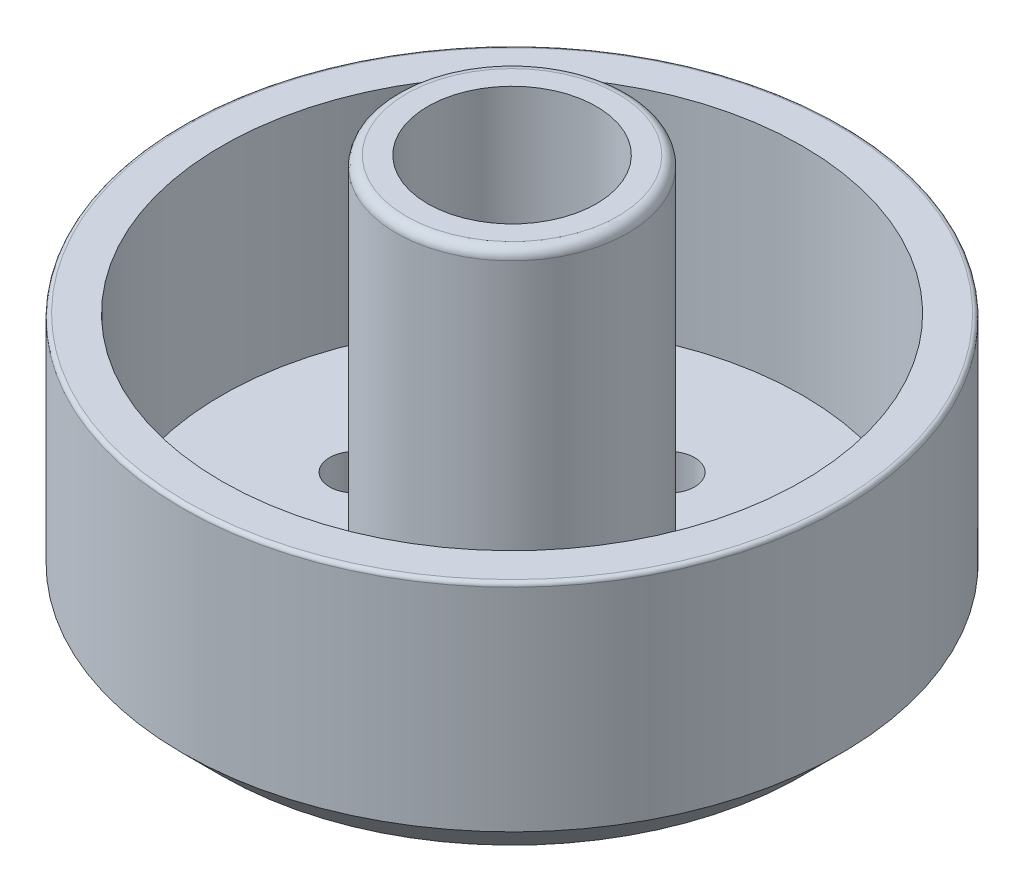
ISO-10303-21;
HEADER;
FILE_DESCRIPTION(('STEP AP214'),'2;1');
FILE_NAME('part.step','',(''),(''),'','','');
FILE_SCHEMA(('AUTOMOTIVE_DESIGN { 1 0 10303 214 1 1 1 1 }'));
ENDSEC;
DATA;
#1=APPLICATION_CONTEXT('core data for automotive mechanical design processes');
#2=APPLICATION_PROTOCOL_DEFINITION('international standard','automotive_design',2000,#1);
#3=PRODUCT_CONTEXT('',#1,'mechanical');
#4=PRODUCT('Part','Part','',(#3));
#5=PRODUCT_RELATED_PRODUCT_CATEGORY('part','',(#4));
#6=PRODUCT_DEFINITION_FORMATION('','',#4);
#7=PRODUCT_DEFINITION_CONTEXT('part definition',#1,'design');
#8=PRODUCT_DEFINITION('design','',#6,#7);
#9=PRODUCT_DEFINITION_SHAPE('','',#8);
#10=(LENGTH_UNIT() NAMED_UNIT(*) SI_UNIT(.MILLI.,.METRE.));
#11=(NAMED_UNIT(*) PLANE_ANGLE_UNIT() SI_UNIT($,.RADIAN.));
#12=(NAMED_UNIT(*) SI_UNIT($,.STERADIAN.) SOLID_ANGLE_UNIT());
#13=UNCERTAINTY_MEASURE_WITH_UNIT(LENGTH_MEASURE(1.E-05),#10,'distance_accuracy_value','');
#14=(GEOMETRIC_REPRESENTATION_CONTEXT(3) GLOBAL_UNCERTAINTY_ASSIGNED_CONTEXT((#13)) GLOBAL_UNIT_ASSIGNED_CONTEXT((#10,
#11,#12)) REPRESENTATION_CONTEXT('',''));
#15=CARTESIAN_POINT('',(0.,0.,0.));
#16=DIRECTION('',(0.,0.,1.));
#17=DIRECTION('',(1.,0.,0.));
#18=AXIS2_PLACEMENT_3D('',#15,#16,#17);
#19=CARTESIAN_POINT('',(0.,0.,0.));
#20=DIRECTION('',(0.,1.,0.));
#21=DIRECTION('',(0.,0.,1.));
#22=AXIS2_PLACEMENT_3D('',#19,#20,#21);
#23=PLANE('',#22);
#24=CARTESIAN_POINT('',(-7.99999999999977,0.,2.26883816723573E-13));
#25=DIRECTION('',(0.,1.,0.));
#26=DIRECTION('',(0.,0.,1.));
#27=AXIS2_PLACEMENT_3D('',#24,#25,#26);
#28=CIRCLE('',#27,1.30000000000036);
#29=CARTESIAN_POINT('',(-7.99999999999977,0.,1.30000000000059));
#30=VERTEX_POINT('',#29);
#31=EDGE_CURVE('E79',#30,#30,#28,.T.);
#32=ORIENTED_EDGE('',*,*,#31,.T.);
#33=EDGE_LOOP('',(#32));
#34=FACE_BOUND('',#33,.T.);
#35=CARTESIAN_POINT('',(4.51808198568511E-13,0.,8.));
#36=DIRECTION('',(0.,1.,0.));
#37=DIRECTION('',(0.,0.,1.));
#38=AXIS2_PLACEMENT_3D('',#35,#36,#37);
#39=CIRCLE('',#38,1.30000000000049);
#40=CARTESIAN_POINT('',(4.51808198568511E-13,0.,9.30000000000049));
#41=VERTEX_POINT('',#40);
#42=EDGE_CURVE('E76',#41,#41,#39,.T.);
#43=ORIENTED_EDGE('',*,*,#42,.T.);
#44=EDGE_LOOP('',(#43));
#45=FACE_BOUND('',#44,.T.);
#46=CARTESIAN_POINT('',(8.,0.,0.));
#47=DIRECTION('',(0.,1.,0.));
#48=DIRECTION('',(0.,0.,1.));
#49=AXIS2_PLACEMENT_3D('',#46,#47,#48);
#50=CIRCLE('',#49,1.3);
#51=CARTESIAN_POINT('',(8.,0.,1.30000000000003));
#52=VERTEX_POINT('',#51);
#53=EDGE_CURVE('E73',#52,#52,#50,.T.);
#54=ORIENTED_EDGE('',*,*,#53,.T.);
#55=EDGE_LOOP('',(#54));
#56=FACE_BOUND('',#55,.T.);
#57=CARTESIAN_POINT('',(0.,0.,0.));
#58=DIRECTION('',(0.,1.,0.));
#59=DIRECTION('',(0.,0.,1.));
#60=AXIS2_PLACEMENT_3D('',#57,#58,#59);
#61=CIRCLE('',#60,4.3);
#62=CARTESIAN_POINT('',(0.,0.,4.3));
#63=VERTEX_POINT('',#62);
#64=EDGE_CURVE('E70',#63,#63,#61,.T.);
#65=ORIENTED_EDGE('',*,*,#64,.T.);
#66=EDGE_LOOP('',(#65));
#67=FACE_BOUND('',#66,.T.);
#68=CARTESIAN_POINT('',(0.,0.,-8.));
#69=DIRECTION('',(0.,1.,0.));
#70=DIRECTION('',(0.,0.,1.));
#71=AXIS2_PLACEMENT_3D('',#68,#69,#70);
#72=CIRCLE('',#71,1.3);
#73=CARTESIAN_POINT('',(0.,0.,-6.7));
#74=VERTEX_POINT('',#73);
#75=EDGE_CURVE('E62',#74,#74,#72,.T.);
#76=ORIENTED_EDGE('',*,*,#75,.T.);
#77=EDGE_LOOP('',(#76));
#78=FACE_BOUND('',#77,.T.);
#79=CARTESIAN_POINT('',(0.,0.,0.));
#80=DIRECTION('',(0.,1.,0.));
#81=DIRECTION('',(0.,0.,1.));
#82=AXIS2_PLACEMENT_3D('',#79,#80,#81);
#83=CIRCLE('',#82,14.8);
#84=CARTESIAN_POINT('',(0.,0.,14.8));
#85=VERTEX_POINT('',#84);
#86=EDGE_CURVE('E101',#85,#85,#83,.T.);
#87=ORIENTED_EDGE('',*,*,#86,.F.);
#88=EDGE_LOOP('',(#87));
#89=FACE_BOUND('',#88,.T.);
#90=ADVANCED_FACE('F42',(#34,#45,#56,#67,#78,#89),#23,.F.);
#91=CARTESIAN_POINT('',(0.,2.,0.));
#92=DIRECTION('',(0.,1.,0.));
#93=DIRECTION('',(0.,0.,1.));
#94=AXIS2_PLACEMENT_3D('',#91,#92,#93);
#95=PLANE('',#94);
#96=CARTESIAN_POINT('',(0.,2.,0.));
#97=DIRECTION('',(0.,1.,0.));
#98=DIRECTION('',(0.,0.,1.));
#99=AXIS2_PLACEMENT_3D('',#96,#97,#98);
#100=CIRCLE('',#99,14.8);
#101=CARTESIAN_POINT('',(0.,2.,14.8));
#102=VERTEX_POINT('',#101);
#103=EDGE_CURVE('E67',#102,#102,#100,.F.);
#104=ORIENTED_EDGE('',*,*,#103,.F.);
#105=EDGE_LOOP('',(#104));
#106=FACE_BOUND('',#105,.T.);
#107=CARTESIAN_POINT('',(-7.99999999999977,2.,2.26883816723573E-13));
#108=DIRECTION('',(0.,1.,0.));
#109=DIRECTION('',(0.,0.,1.));
#110=AXIS2_PLACEMENT_3D('',#107,#108,#109);
#111=CIRCLE('',#110,1.30000000000036);
#112=CARTESIAN_POINT('',(-7.99999999999977,2.,1.30000000000059));
#113=VERTEX_POINT('',#112);
#114=EDGE_CURVE('E63',#113,#113,#111,.T.);
#115=ORIENTED_EDGE('',*,*,#114,.F.);
#116=EDGE_LOOP('',(#115));
#117=FACE_BOUND('',#116,.T.);
#118=CARTESIAN_POINT('',(4.51808198568511E-13,2.,8.));
#119=DIRECTION('',(0.,1.,0.));
#120=DIRECTION('',(0.,0.,1.));
#121=AXIS2_PLACEMENT_3D('',#118,#119,#120);
#122=CIRCLE('',#121,1.30000000000049);
#123=CARTESIAN_POINT('',(4.51808198568511E-13,2.,9.30000000000049));
#124=VERTEX_POINT('',#123);
#125=EDGE_CURVE('E66',#124,#124,#122,.T.);
#126=ORIENTED_EDGE('',*,*,#125,.F.);
#127=EDGE_LOOP('',(#126));
#128=FACE_BOUND('',#127,.T.);
#129=CARTESIAN_POINT('',(8.,2.,0.));
#130=DIRECTION('',(0.,1.,0.));
#131=DIRECTION('',(0.,0.,1.));
#132=AXIS2_PLACEMENT_3D('',#129,#130,#131);
#133=CIRCLE('',#132,1.3);
#134=CARTESIAN_POINT('',(8.,2.,1.30000000000003));
#135=VERTEX_POINT('',#134);
#136=EDGE_CURVE('E85',#135,#135,#133,.T.);
#137=ORIENTED_EDGE('',*,*,#136,.F.);
#138=EDGE_LOOP('',(#137));
#139=FACE_BOUND('',#138,.T.);
#140=CARTESIAN_POINT('',(0.,2.,-8.));
#141=DIRECTION('',(0.,1.,0.));
#142=DIRECTION('',(0.,0.,1.));
#143=AXIS2_PLACEMENT_3D('',#140,#141,#142);
#144=CIRCLE('',#143,1.3);
#145=CARTESIAN_POINT('',(0.,2.,-6.7));
#146=VERTEX_POINT('',#145);
#147=EDGE_CURVE('E82',#146,#146,#144,.T.);
#148=ORIENTED_EDGE('',*,*,#147,.F.);
#149=EDGE_LOOP('',(#148));
#150=FACE_BOUND('',#149,.T.);
#151=CARTESIAN_POINT('',(0.,2.,0.));
#152=DIRECTION('',(0.,1.,0.));
#153=DIRECTION('',(0.,0.,1.));
#154=AXIS2_PLACEMENT_3D('',#151,#152,#153);
#155=CIRCLE('',#154,5.9);
#156=CARTESIAN_POINT('',(0.,2.,5.9));
#157=VERTEX_POINT('',#156);
#158=EDGE_CURVE('E95',#157,#157,#155,.T.);
#159=ORIENTED_EDGE('',*,*,#158,.F.);
#160=EDGE_LOOP('',(#159));
#161=FACE_BOUND('',#160,.T.);
#162=ADVANCED_FACE('F118',(#106,#117,#128,#139,#150,#161),#95,.T.);
#163=CARTESIAN_POINT('',(0.,13.,-8.));
#164=DIRECTION('',(0.,-1.,0.));
#165=DIRECTION('',(0.,0.,-1.));
#166=AXIS2_PLACEMENT_3D('',#163,#164,#165);
#167=CYLINDRICAL_SURFACE('',#166,1.3);
#168=ORIENTED_EDGE('',*,*,#75,.F.);
#169=EDGE_LOOP('',(#168));
#170=FACE_BOUND('',#169,.T.);
#171=ORIENTED_EDGE('',*,*,#147,.T.);
#172=EDGE_LOOP('',(#171));
#173=FACE_BOUND('',#172,.T.);
#174=ADVANCED_FACE('F124',(#170,#173),#167,.F.);
#175=CARTESIAN_POINT('',(0.,13.,0.));
#176=DIRECTION('',(0.,-1.,0.));
#177=DIRECTION('',(0.,0.,-1.));
#178=AXIS2_PLACEMENT_3D('',#175,#176,#177);
#179=CYLINDRICAL_SURFACE('',#178,4.3);
#180=ORIENTED_EDGE('',*,*,#64,.F.);
#181=EDGE_LOOP('',(#180));
#182=FACE_BOUND('',#181,.T.);
#183=CARTESIAN_POINT('',(0.,20.,0.));
#184=DIRECTION('',(0.,1.,0.));
#185=DIRECTION('',(0.,0.,1.));
#186=AXIS2_PLACEMENT_3D('',#183,#184,#185);
#187=CIRCLE('',#186,4.3);
#188=CARTESIAN_POINT('',(0.,20.,4.3));
#189=VERTEX_POINT('',#188);
#190=EDGE_CURVE('E98',#189,#189,#187,.T.);
#191=ORIENTED_EDGE('',*,*,#190,.T.);
#192=EDGE_LOOP('',(#191));
#193=FACE_BOUND('',#192,.T.);
#194=ADVANCED_FACE('F172',(#182,#193),#179,.F.);
#195=CARTESIAN_POINT('',(8.,13.,0.));
#196=DIRECTION('',(0.,-1.,0.));
#197=DIRECTION('',(0.,0.,-1.));
#198=AXIS2_PLACEMENT_3D('',#195,#196,#197);
#199=CYLINDRICAL_SURFACE('',#198,1.3);
#200=ORIENTED_EDGE('',*,*,#53,.F.);
#201=EDGE_LOOP('',(#200));
#202=FACE_BOUND('',#201,.T.);
#203=ORIENTED_EDGE('',*,*,#136,.T.);
#204=EDGE_LOOP('',(#203));
#205=FACE_BOUND('',#204,.T.);
#206=ADVANCED_FACE('F164',(#202,#205),#199,.F.);
#207=CARTESIAN_POINT('',(4.51808198568511E-13,13.,8.));
#208=DIRECTION('',(0.,-1.,0.));
#209=DIRECTION('',(0.,0.,-1.));
#210=AXIS2_PLACEMENT_3D('',#207,#208,#209);
#211=CYLINDRICAL_SURFACE('',#210,1.30000000000049);
#212=ORIENTED_EDGE('',*,*,#42,.F.);
#213=EDGE_LOOP('',(#212));
#214=FACE_BOUND('',#213,.T.);
#215=ORIENTED_EDGE('',*,*,#125,.T.);
#216=EDGE_LOOP('',(#215));
#217=FACE_BOUND('',#216,.T.);
#218=ADVANCED_FACE('F158',(#214,#217),#211,.F.);
#219=CARTESIAN_POINT('',(-7.99999999999977,13.,2.26883816723573E-13));
#220=DIRECTION('',(0.,-1.,0.));
#221=DIRECTION('',(0.,0.,-1.));
#222=AXIS2_PLACEMENT_3D('',#219,#220,#221);
#223=CYLINDRICAL_SURFACE('',#222,1.30000000000036);
#224=ORIENTED_EDGE('',*,*,#31,.F.);
#225=EDGE_LOOP('',(#224));
#226=FACE_BOUND('',#225,.T.);
#227=ORIENTED_EDGE('',*,*,#114,.T.);
#228=EDGE_LOOP('',(#227));
#229=FACE_BOUND('',#228,.T.);
#230=ADVANCED_FACE('F152',(#226,#229),#223,.F.);
#231=CARTESIAN_POINT('',(0.,13.,0.));
#232=DIRECTION('',(0.,1.,0.));
#233=DIRECTION('',(0.,0.,1.));
#234=AXIS2_PLACEMENT_3D('',#231,#232,#233);
#235=PLANE('',#234);
#236=CARTESIAN_POINT('',(0.,13.,0.));
#237=DIRECTION('',(0.,1.,0.));
#238=DIRECTION('',(0.,0.,1.));
#239=AXIS2_PLACEMENT_3D('',#236,#237,#238);
#240=CIRCLE('',#239,16.6);
#241=CARTESIAN_POINT('',(0.,13.,16.6));
#242=VERTEX_POINT('',#241);
#243=EDGE_CURVE('E57',#242,#242,#240,.T.);
#244=ORIENTED_EDGE('',*,*,#243,.T.);
#245=EDGE_LOOP('',(#244));
#246=FACE_BOUND('',#245,.T.);
#247=CARTESIAN_POINT('',(0.,13.,0.));
#248=DIRECTION('',(0.,1.,0.));
#249=DIRECTION('',(0.,0.,1.));
#250=AXIS2_PLACEMENT_3D('',#247,#248,#249);
#251=CIRCLE('',#250,14.8);
#252=CARTESIAN_POINT('',(0.,13.,14.8));
#253=VERTEX_POINT('',#252);
#254=EDGE_CURVE('E92',#253,#253,#251,.T.);
#255=ORIENTED_EDGE('',*,*,#254,.F.);
#256=EDGE_LOOP('',(#255));
#257=FACE_BOUND('',#256,.T.);
#258=ADVANCED_FACE('F130',(#246,#257),#235,.T.);
#259=CARTESIAN_POINT('',(0.,13.,0.));
#260=DIRECTION('',(0.,-1.,0.));
#261=DIRECTION('',(0.,0.,-1.));
#262=AXIS2_PLACEMENT_3D('',#259,#260,#261);
#263=CYLINDRICAL_SURFACE('',#262,16.8);
#264=CARTESIAN_POINT('',(0.,1.99999999999995,0.));
#265=DIRECTION('',(0.,1.,0.));
#266=DIRECTION('',(0.,0.,1.));
#267=AXIS2_PLACEMENT_3D('',#264,#265,#266);
#268=CIRCLE('',#267,16.8);
#269=CARTESIAN_POINT('',(0.,1.99999999999995,16.8));
#270=VERTEX_POINT('',#269);
#271=EDGE_CURVE('E104',#270,#270,#268,.T.);
#272=ORIENTED_EDGE('',*,*,#271,.T.);
#273=EDGE_LOOP('',(#272));
#274=FACE_BOUND('',#273,.T.);
#275=CARTESIAN_POINT('',(0.,12.8,0.));
#276=DIRECTION('',(0.,1.,0.));
#277=DIRECTION('',(0.,0.,1.));
#278=AXIS2_PLACEMENT_3D('',#275,#276,#277);
#279=CIRCLE('',#278,16.8);
#280=CARTESIAN_POINT('',(0.,12.8,16.8));
#281=VERTEX_POINT('',#280);
#282=EDGE_CURVE('E53',#281,#281,#279,.F.);
#283=ORIENTED_EDGE('',*,*,#282,.T.);
#284=EDGE_LOOP('',(#283));
#285=FACE_BOUND('',#284,.T.);
#286=ADVANCED_FACE('F108',(#274,#285),#263,.T.);
#287=CARTESIAN_POINT('',(0.,-41.8607214462436,0.));
#288=DIRECTION('',(0.,1.,0.));
#289=DIRECTION('',(0.,0.,1.));
#290=AXIS2_PLACEMENT_3D('',#287,#288,#289);
#291=CYLINDRICAL_SURFACE('',#290,14.8);
#292=ORIENTED_EDGE('',*,*,#103,.T.);
#293=EDGE_LOOP('',(#292));
#294=FACE_BOUND('',#293,.T.);
#295=ORIENTED_EDGE('',*,*,#254,.T.);
#296=EDGE_LOOP('',(#295));
#297=FACE_BOUND('',#296,.T.);
#298=ADVANCED_FACE('F133',(#294,#297),#291,.F.);
#299=CARTESIAN_POINT('',(0.,12.8,0.));
#300=DIRECTION('',(0.,1.,0.));
#301=DIRECTION('',(0.,0.,1.));
#302=AXIS2_PLACEMENT_3D('',#299,#300,#301);
#303=TOROIDAL_SURFACE('',#302,16.6,0.2);
#304=ORIENTED_EDGE('',*,*,#282,.F.);
#305=EDGE_LOOP('',(#304));
#306=FACE_BOUND('',#305,.T.);
#307=ORIENTED_EDGE('',*,*,#243,.F.);
#308=EDGE_LOOP('',(#307));
#309=FACE_BOUND('',#308,.T.);
#310=ADVANCED_FACE('F134',(#306,#309),#303,.T.);
#311=CARTESIAN_POINT('',(0.,20.,0.));
#312=DIRECTION('',(0.,1.,0.));
#313=DIRECTION('',(0.,0.,1.));
#314=AXIS2_PLACEMENT_3D('',#311,#312,#313);
#315=PLANE('',#314);
#316=CARTESIAN_POINT('',(0.,20.,0.));
#317=DIRECTION('',(0.,1.,0.));
#318=DIRECTION('',(0.,0.,1.));
#319=AXIS2_PLACEMENT_3D('',#316,#317,#318);
#320=CIRCLE('',#319,5.4);
#321=CARTESIAN_POINT('',(0.,20.,5.4));
#322=VERTEX_POINT('',#321);
#323=EDGE_CURVE('E49',#322,#322,#320,.T.);
#324=ORIENTED_EDGE('',*,*,#323,.T.);
#325=EDGE_LOOP('',(#324));
#326=FACE_BOUND('',#325,.T.);
#327=ORIENTED_EDGE('',*,*,#190,.F.);
#328=EDGE_LOOP('',(#327));
#329=FACE_BOUND('',#328,.T.);
#330=ADVANCED_FACE('F136',(#326,#329),#315,.T.);
#331=CARTESIAN_POINT('',(0.,20.,0.));
#332=DIRECTION('',(0.,-1.,0.));
#333=DIRECTION('',(0.,0.,-1.));
#334=AXIS2_PLACEMENT_3D('',#331,#332,#333);
#335=CYLINDRICAL_SURFACE('',#334,5.9);
#336=CARTESIAN_POINT('',(0.,19.5,0.));
#337=DIRECTION('',(0.,1.,0.));
#338=DIRECTION('',(0.,0.,1.));
#339=AXIS2_PLACEMENT_3D('',#336,#337,#338);
#340=CIRCLE('',#339,5.9);
#341=CARTESIAN_POINT('',(0.,19.5,5.9));
#342=VERTEX_POINT('',#341);
#343=EDGE_CURVE('E11',#342,#342,#340,.F.);
#344=ORIENTED_EDGE('',*,*,#343,.T.);
#345=EDGE_LOOP('',(#344));
#346=FACE_BOUND('',#345,.T.);
#347=ORIENTED_EDGE('',*,*,#158,.T.);
#348=EDGE_LOOP('',(#347));
#349=FACE_BOUND('',#348,.T.);
#350=ADVANCED_FACE('F142',(#346,#349),#335,.T.);
#351=CARTESIAN_POINT('',(0.,19.5,0.));
#352=DIRECTION('',(0.,1.,0.));
#353=DIRECTION('',(0.,0.,1.));
#354=AXIS2_PLACEMENT_3D('',#351,#352,#353);
#355=TOROIDAL_SURFACE('',#354,5.4,0.5);
#356=ORIENTED_EDGE('',*,*,#343,.F.);
#357=EDGE_LOOP('',(#356));
#358=FACE_BOUND('',#357,.T.);
#359=ORIENTED_EDGE('',*,*,#323,.F.);
#360=EDGE_LOOP('',(#359));
#361=FACE_BOUND('',#360,.T.);
#362=ADVANCED_FACE('F44',(#358,#361),#355,.T.);
#363=CARTESIAN_POINT('',(0.,0.,0.));
#364=DIRECTION('',(0.,1.,0.));
#365=DIRECTION('',(0.,0.,1.));
#366=AXIS2_PLACEMENT_3D('',#363,#364,#365);
#367=CONICAL_SURFACE('',#366,14.8,0.78539816339746);
#368=ORIENTED_EDGE('',*,*,#271,.F.);
#369=EDGE_LOOP('',(#368));
#370=FACE_BOUND('',#369,.T.);
#371=ORIENTED_EDGE('',*,*,#86,.T.);
#372=EDGE_LOOP('',(#371));
#373=FACE_BOUND('',#372,.T.);
#374=ADVANCED_FACE('F111',(#370,#373),#367,.T.);
#375=CLOSED_SHELL('',(#90,#162,#174,#194,#206,#218,#230,#258,#286,#298,#310,#330,#350,#362,#374));
#376=MANIFOLD_SOLID_BREP('B2',#375);
#377=ADVANCED_BREP_SHAPE_REPRESENTATION('',(#18,#376),#14);
#378=SHAPE_DEFINITION_REPRESENTATION(#9,#377);
ENDSEC;
END-ISO-10303-21;
